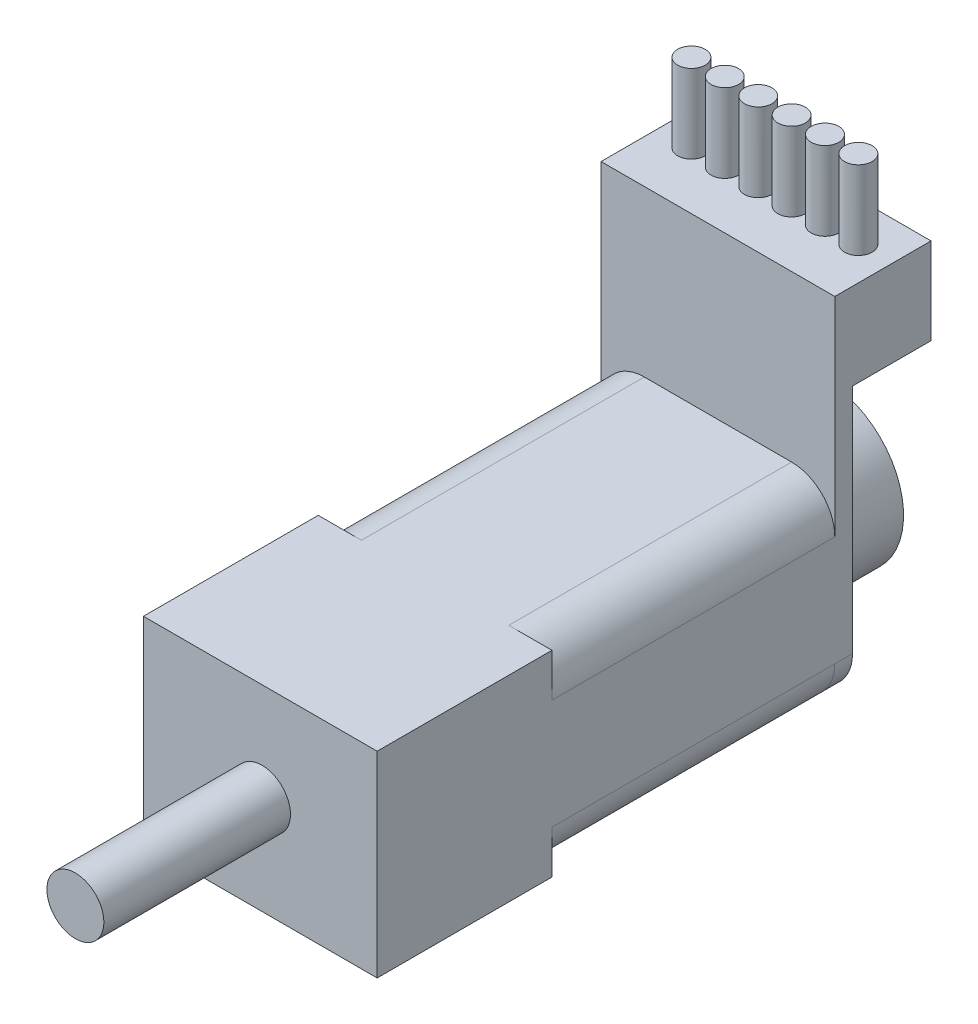
ISO-10303-21;
HEADER;
FILE_DESCRIPTION(('STEP AP214'),'2;1');
FILE_NAME('part.step','',(''),(''),'','','');
FILE_SCHEMA(('AUTOMOTIVE_DESIGN { 1 0 10303 214 1 1 1 1 }'));
ENDSEC;
DATA;
#1=APPLICATION_CONTEXT('core data for automotive mechanical design processes');
#2=APPLICATION_PROTOCOL_DEFINITION('international standard','automotive_design',2000,#1);
#3=PRODUCT_CONTEXT('',#1,'mechanical');
#4=PRODUCT('Part','Part','',(#3));
#5=PRODUCT_RELATED_PRODUCT_CATEGORY('part','',(#4));
#6=PRODUCT_DEFINITION_FORMATION('','',#4);
#7=PRODUCT_DEFINITION_CONTEXT('part definition',#1,'design');
#8=PRODUCT_DEFINITION('design','',#6,#7);
#9=PRODUCT_DEFINITION_SHAPE('','',#8);
#10=(LENGTH_UNIT() NAMED_UNIT(*) SI_UNIT(.MILLI.,.METRE.));
#11=(NAMED_UNIT(*) PLANE_ANGLE_UNIT() SI_UNIT($,.RADIAN.));
#12=(NAMED_UNIT(*) SI_UNIT($,.STERADIAN.) SOLID_ANGLE_UNIT());
#13=UNCERTAINTY_MEASURE_WITH_UNIT(LENGTH_MEASURE(1.E-05),#10,'distance_accuracy_value','');
#14=(GEOMETRIC_REPRESENTATION_CONTEXT(3) GLOBAL_UNCERTAINTY_ASSIGNED_CONTEXT((#13)) GLOBAL_UNIT_ASSIGNED_CONTEXT((#10,
#11,#12)) REPRESENTATION_CONTEXT('',''));
#15=CARTESIAN_POINT('',(0.,0.,0.));
#16=DIRECTION('',(0.,0.,1.));
#17=DIRECTION('',(1.,0.,0.));
#18=AXIS2_PLACEMENT_3D('',#15,#16,#17);
#19=CARTESIAN_POINT('',(0.,0.,-0.9));
#20=DIRECTION('',(0.,0.,-1.));
#21=DIRECTION('',(-1.,0.,0.));
#22=AXIS2_PLACEMENT_3D('',#19,#20,#21);
#23=PLANE('',#22);
#24=CARTESIAN_POINT('',(5.9,5.,-0.9));
#25=DIRECTION('',(0.,0.,-1.));
#26=DIRECTION('',(-1.,0.,0.));
#27=AXIS2_PLACEMENT_3D('',#24,#25,#26);
#28=CIRCLE('',#27,4.);
#29=CARTESIAN_POINT('',(1.9,5.,-0.9));
#30=VERTEX_POINT('',#29);
#31=EDGE_CURVE('E207',#30,#30,#28,.T.);
#32=ORIENTED_EDGE('',*,*,#31,.F.);
#33=EDGE_LOOP('',(#32));
#34=FACE_BOUND('',#33,.T.);
#35=DIRECTION('',(0.,1.,0.));
#36=VECTOR('',#35,1.);
#37=CARTESIAN_POINT('',(0.,0.,-0.9));
#38=LINE('',#37,#36);
#39=CARTESIAN_POINT('',(0.,2.2,-0.9));
#40=VERTEX_POINT('',#39);
#41=CARTESIAN_POINT('',(0.,14.,-0.9));
#42=VERTEX_POINT('',#41);
#43=EDGE_CURVE('E66',#40,#42,#38,.T.);
#44=ORIENTED_EDGE('',*,*,#43,.T.);
#45=DIRECTION('',(-1.,0.,0.));
#46=VECTOR('',#45,1.);
#47=CARTESIAN_POINT('',(11.9,14.,-0.9));
#48=LINE('',#47,#46);
#49=CARTESIAN_POINT('',(11.9,14.,-0.9));
#50=VERTEX_POINT('',#49);
#51=EDGE_CURVE('E61',#50,#42,#48,.T.);
#52=ORIENTED_EDGE('',*,*,#51,.F.);
#53=DIRECTION('',(0.,-1.,0.));
#54=VECTOR('',#53,1.);
#55=CARTESIAN_POINT('',(11.9,0.,-0.9));
#56=LINE('',#55,#54);
#57=CARTESIAN_POINT('',(11.9,2.2,-0.9));
#58=VERTEX_POINT('',#57);
#59=EDGE_CURVE('E195',#50,#58,#56,.T.);
#60=ORIENTED_EDGE('',*,*,#59,.T.);
#61=CARTESIAN_POINT('',(9.7,2.2,-0.9));
#62=DIRECTION('',(0.,0.,-1.));
#63=DIRECTION('',(-1.,0.,0.));
#64=AXIS2_PLACEMENT_3D('',#61,#62,#63);
#65=CIRCLE('',#64,2.2);
#66=CARTESIAN_POINT('',(9.7,0.,-0.9));
#67=VERTEX_POINT('',#66);
#68=EDGE_CURVE('E365',#58,#67,#65,.T.);
#69=ORIENTED_EDGE('',*,*,#68,.T.);
#70=DIRECTION('',(-1.,0.,0.));
#71=VECTOR('',#70,1.);
#72=CARTESIAN_POINT('',(11.9,0.,-0.9));
#73=LINE('',#72,#71);
#74=CARTESIAN_POINT('',(2.2,0.,-0.9));
#75=VERTEX_POINT('',#74);
#76=EDGE_CURVE('E213',#67,#75,#73,.T.);
#77=ORIENTED_EDGE('',*,*,#76,.T.);
#78=CARTESIAN_POINT('',(2.2,2.2,-0.9));
#79=DIRECTION('',(0.,0.,-1.));
#80=DIRECTION('',(-1.,0.,0.));
#81=AXIS2_PLACEMENT_3D('',#78,#79,#80);
#82=CIRCLE('',#81,2.2);
#83=EDGE_CURVE('E368',#75,#40,#82,.T.);
#84=ORIENTED_EDGE('',*,*,#83,.T.);
#85=EDGE_LOOP('',(#44,#52,#60,#69,#77,#84));
#86=FACE_BOUND('',#85,.T.);
#87=ADVANCED_FACE('F45',(#34,#86),#23,.T.);
#88=CARTESIAN_POINT('',(0.,0.,14.4));
#89=DIRECTION('',(1.,0.,0.));
#90=DIRECTION('',(0.,0.,-1.));
#91=AXIS2_PLACEMENT_3D('',#88,#89,#90);
#92=PLANE('',#91);
#93=ORIENTED_EDGE('',*,*,#43,.F.);
#94=DIRECTION('',(0.,0.,1.));
#95=VECTOR('',#94,1.);
#96=CARTESIAN_POINT('',(0.,2.2,14.4));
#97=LINE('',#96,#95);
#98=CARTESIAN_POINT('',(0.,2.2,0.));
#99=VERTEX_POINT('',#98);
#100=EDGE_CURVE('E246',#40,#99,#97,.T.);
#101=ORIENTED_EDGE('',*,*,#100,.T.);
#102=DIRECTION('',(0.,0.,-1.));
#103=VECTOR('',#102,1.);
#104=CARTESIAN_POINT('',(0.,2.2,14.4));
#105=LINE('',#104,#103);
#106=CARTESIAN_POINT('',(0.,2.2,14.4));
#107=VERTEX_POINT('',#106);
#108=EDGE_CURVE('E324',#99,#107,#105,.F.);
#109=ORIENTED_EDGE('',*,*,#108,.T.);
#110=DIRECTION('',(0.,-1.,0.));
#111=VECTOR('',#110,1.);
#112=CARTESIAN_POINT('',(0.,0.,14.4));
#113=LINE('',#112,#111);
#114=CARTESIAN_POINT('',(0.,0.,14.4));
#115=VERTEX_POINT('',#114);
#116=EDGE_CURVE('E241',#107,#115,#113,.T.);
#117=ORIENTED_EDGE('',*,*,#116,.T.);
#118=DIRECTION('',(0.,0.,-1.));
#119=VECTOR('',#118,1.);
#120=CARTESIAN_POINT('',(0.,0.,23.3));
#121=LINE('',#120,#119);
#122=CARTESIAN_POINT('',(0.,0.,23.3));
#123=VERTEX_POINT('',#122);
#124=EDGE_CURVE('E292',#123,#115,#121,.T.);
#125=ORIENTED_EDGE('',*,*,#124,.F.);
#126=DIRECTION('',(0.,-1.,0.));
#127=VECTOR('',#126,1.);
#128=CARTESIAN_POINT('',(0.,0.,23.3));
#129=LINE('',#128,#127);
#130=CARTESIAN_POINT('',(0.,10.,23.3));
#131=VERTEX_POINT('',#130);
#132=EDGE_CURVE('E248',#131,#123,#129,.T.);
#133=ORIENTED_EDGE('',*,*,#132,.F.);
#134=DIRECTION('',(0.,0.,-1.));
#135=VECTOR('',#134,1.);
#136=CARTESIAN_POINT('',(0.,10.,23.3));
#137=LINE('',#136,#135);
#138=CARTESIAN_POINT('',(0.,10.,14.4));
#139=VERTEX_POINT('',#138);
#140=EDGE_CURVE('E262',#131,#139,#137,.T.);
#141=ORIENTED_EDGE('',*,*,#140,.T.);
#142=CARTESIAN_POINT('',(0.,7.8,14.4));
#143=VERTEX_POINT('',#142);
#144=EDGE_CURVE('E263',#139,#143,#113,.T.);
#145=ORIENTED_EDGE('',*,*,#144,.T.);
#146=DIRECTION('',(0.,0.,-1.));
#147=VECTOR('',#146,1.);
#148=CARTESIAN_POINT('',(0.,7.8,14.4));
#149=LINE('',#148,#147);
#150=CARTESIAN_POINT('',(0.,7.8,0.));
#151=VERTEX_POINT('',#150);
#152=EDGE_CURVE('E320',#143,#151,#149,.T.);
#153=ORIENTED_EDGE('',*,*,#152,.T.);
#154=DIRECTION('',(0.,1.,0.));
#155=VECTOR('',#154,1.);
#156=CARTESIAN_POINT('',(0.,0.,0.));
#157=LINE('',#156,#155);
#158=CARTESIAN_POINT('',(0.,18.4,0.));
#159=VERTEX_POINT('',#158);
#160=EDGE_CURVE('E202',#151,#159,#157,.T.);
#161=ORIENTED_EDGE('',*,*,#160,.T.);
#162=DIRECTION('',(0.,0.,1.));
#163=VECTOR('',#162,1.);
#164=CARTESIAN_POINT('',(0.,18.4,-0.9));
#165=LINE('',#164,#163);
#166=CARTESIAN_POINT('',(0.,18.4,-4.9));
#167=VERTEX_POINT('',#166);
#168=EDGE_CURVE('E233',#167,#159,#165,.T.);
#169=ORIENTED_EDGE('',*,*,#168,.F.);
#170=DIRECTION('',(0.,1.,0.));
#171=VECTOR('',#170,1.);
#172=CARTESIAN_POINT('',(0.,18.4,-4.9));
#173=LINE('',#172,#171);
#174=CARTESIAN_POINT('',(0.,14.,-4.9));
#175=VERTEX_POINT('',#174);
#176=EDGE_CURVE('E180',#175,#167,#173,.T.);
#177=ORIENTED_EDGE('',*,*,#176,.F.);
#178=DIRECTION('',(0.,0.,1.));
#179=VECTOR('',#178,1.);
#180=CARTESIAN_POINT('',(0.,14.,-4.9));
#181=LINE('',#180,#179);
#182=EDGE_CURVE('E175',#175,#42,#181,.T.);
#183=ORIENTED_EDGE('',*,*,#182,.T.);
#184=EDGE_LOOP('',(#93,#101,#109,#117,#125,#133,#141,#145,#153,#161,#169,#177,#183));
#185=FACE_BOUND('',#184,.T.);
#186=ADVANCED_FACE('F433',(#185),#92,.F.);
#187=CARTESIAN_POINT('',(0.,0.,14.4));
#188=DIRECTION('',(0.,1.,0.));
#189=DIRECTION('',(0.,0.,1.));
#190=AXIS2_PLACEMENT_3D('',#187,#188,#189);
#191=PLANE('',#190);
#192=DIRECTION('',(0.,0.,-1.));
#193=VECTOR('',#192,1.);
#194=CARTESIAN_POINT('',(2.2,0.,14.4));
#195=LINE('',#194,#193);
#196=CARTESIAN_POINT('',(2.2,0.,14.4));
#197=VERTEX_POINT('',#196);
#198=CARTESIAN_POINT('',(2.2,0.,0.));
#199=VERTEX_POINT('',#198);
#200=EDGE_CURVE('E302',#197,#199,#195,.T.);
#201=ORIENTED_EDGE('',*,*,#200,.T.);
#202=DIRECTION('',(0.,0.,1.));
#203=VECTOR('',#202,1.);
#204=CARTESIAN_POINT('',(2.2,0.,14.4));
#205=LINE('',#204,#203);
#206=EDGE_CURVE('E362',#199,#75,#205,.F.);
#207=ORIENTED_EDGE('',*,*,#206,.T.);
#208=ORIENTED_EDGE('',*,*,#76,.F.);
#209=DIRECTION('',(0.,0.,1.));
#210=VECTOR('',#209,1.);
#211=CARTESIAN_POINT('',(9.7,0.,14.4));
#212=LINE('',#211,#210);
#213=CARTESIAN_POINT('',(9.7,0.,0.));
#214=VERTEX_POINT('',#213);
#215=EDGE_CURVE('E358',#67,#214,#212,.T.);
#216=ORIENTED_EDGE('',*,*,#215,.T.);
#217=DIRECTION('',(0.,0.,-1.));
#218=VECTOR('',#217,1.);
#219=CARTESIAN_POINT('',(9.7,0.,14.4));
#220=LINE('',#219,#218);
#221=CARTESIAN_POINT('',(9.7,0.,14.4));
#222=VERTEX_POINT('',#221);
#223=EDGE_CURVE('E299',#214,#222,#220,.F.);
#224=ORIENTED_EDGE('',*,*,#223,.T.);
#225=DIRECTION('',(1.,0.,0.));
#226=VECTOR('',#225,1.);
#227=CARTESIAN_POINT('',(0.,0.,14.4));
#228=LINE('',#227,#226);
#229=CARTESIAN_POINT('',(11.9,0.,14.4));
#230=VERTEX_POINT('',#229);
#231=EDGE_CURVE('E267',#222,#230,#228,.T.);
#232=ORIENTED_EDGE('',*,*,#231,.T.);
#233=DIRECTION('',(0.,0.,-1.));
#234=VECTOR('',#233,1.);
#235=CARTESIAN_POINT('',(11.9,0.,23.3));
#236=LINE('',#235,#234);
#237=CARTESIAN_POINT('',(11.9,0.,23.3));
#238=VERTEX_POINT('',#237);
#239=EDGE_CURVE('E288',#238,#230,#236,.T.);
#240=ORIENTED_EDGE('',*,*,#239,.F.);
#241=DIRECTION('',(1.,0.,0.));
#242=VECTOR('',#241,1.);
#243=CARTESIAN_POINT('',(0.,0.,23.3));
#244=LINE('',#243,#242);
#245=EDGE_CURVE('E252',#123,#238,#244,.T.);
#246=ORIENTED_EDGE('',*,*,#245,.F.);
#247=ORIENTED_EDGE('',*,*,#124,.T.);
#248=EDGE_CURVE('E268',#115,#197,#228,.T.);
#249=ORIENTED_EDGE('',*,*,#248,.T.);
#250=EDGE_LOOP('',(#201,#207,#208,#216,#224,#232,#240,#246,#247,#249));
#251=FACE_BOUND('',#250,.T.);
#252=ADVANCED_FACE('F440',(#251),#191,.F.);
#253=CARTESIAN_POINT('',(11.9,0.,14.4));
#254=DIRECTION('',(-1.,0.,0.));
#255=DIRECTION('',(0.,0.,1.));
#256=AXIS2_PLACEMENT_3D('',#253,#254,#255);
#257=PLANE('',#256);
#258=DIRECTION('',(0.,0.,-1.));
#259=VECTOR('',#258,1.);
#260=CARTESIAN_POINT('',(11.9,2.2,14.4));
#261=LINE('',#260,#259);
#262=CARTESIAN_POINT('',(11.9,2.2,14.4));
#263=VERTEX_POINT('',#262);
#264=CARTESIAN_POINT('',(11.9,2.2,0.));
#265=VERTEX_POINT('',#264);
#266=EDGE_CURVE('E247',#263,#265,#261,.T.);
#267=ORIENTED_EDGE('',*,*,#266,.T.);
#268=DIRECTION('',(0.,0.,1.));
#269=VECTOR('',#268,1.);
#270=CARTESIAN_POINT('',(11.9,2.2,14.4));
#271=LINE('',#270,#269);
#272=EDGE_CURVE('E212',#265,#58,#271,.F.);
#273=ORIENTED_EDGE('',*,*,#272,.T.);
#274=ORIENTED_EDGE('',*,*,#59,.F.);
#275=DIRECTION('',(0.,0.,1.));
#276=VECTOR('',#275,1.);
#277=CARTESIAN_POINT('',(11.9,14.,-4.9));
#278=LINE('',#277,#276);
#279=CARTESIAN_POINT('',(11.9,14.,-4.9));
#280=VERTEX_POINT('',#279);
#281=EDGE_CURVE('E173',#280,#50,#278,.T.);
#282=ORIENTED_EDGE('',*,*,#281,.F.);
#283=DIRECTION('',(0.,-1.,0.));
#284=VECTOR('',#283,1.);
#285=CARTESIAN_POINT('',(11.9,18.4,-4.9));
#286=LINE('',#285,#284);
#287=CARTESIAN_POINT('',(11.9,18.4,-4.9));
#288=VERTEX_POINT('',#287);
#289=EDGE_CURVE('E181',#288,#280,#286,.T.);
#290=ORIENTED_EDGE('',*,*,#289,.F.);
#291=DIRECTION('',(0.,0.,1.));
#292=VECTOR('',#291,1.);
#293=CARTESIAN_POINT('',(11.9,18.4,-0.9));
#294=LINE('',#293,#292);
#295=CARTESIAN_POINT('',(11.9,18.4,0.));
#296=VERTEX_POINT('',#295);
#297=EDGE_CURVE('E222',#288,#296,#294,.T.);
#298=ORIENTED_EDGE('',*,*,#297,.T.);
#299=DIRECTION('',(0.,-1.,0.));
#300=VECTOR('',#299,1.);
#301=CARTESIAN_POINT('',(11.9,0.,0.));
#302=LINE('',#301,#300);
#303=CARTESIAN_POINT('',(11.9,7.8,0.));
#304=VERTEX_POINT('',#303);
#305=EDGE_CURVE('E217',#296,#304,#302,.T.);
#306=ORIENTED_EDGE('',*,*,#305,.T.);
#307=DIRECTION('',(0.,0.,-1.));
#308=VECTOR('',#307,1.);
#309=CARTESIAN_POINT('',(11.9,7.8,14.4));
#310=LINE('',#309,#308);
#311=CARTESIAN_POINT('',(11.9,7.8,14.4));
#312=VERTEX_POINT('',#311);
#313=EDGE_CURVE('E350',#304,#312,#310,.F.);
#314=ORIENTED_EDGE('',*,*,#313,.T.);
#315=DIRECTION('',(0.,1.,0.));
#316=VECTOR('',#315,1.);
#317=CARTESIAN_POINT('',(11.9,0.,14.4));
#318=LINE('',#317,#316);
#319=CARTESIAN_POINT('',(11.9,10.,14.4));
#320=VERTEX_POINT('',#319);
#321=EDGE_CURVE('E272',#312,#320,#318,.T.);
#322=ORIENTED_EDGE('',*,*,#321,.T.);
#323=DIRECTION('',(0.,0.,-1.));
#324=VECTOR('',#323,1.);
#325=CARTESIAN_POINT('',(11.9,10.,23.3));
#326=LINE('',#325,#324);
#327=CARTESIAN_POINT('',(11.9,10.,23.3));
#328=VERTEX_POINT('',#327);
#329=EDGE_CURVE('E284',#328,#320,#326,.T.);
#330=ORIENTED_EDGE('',*,*,#329,.F.);
#331=DIRECTION('',(0.,1.,0.));
#332=VECTOR('',#331,1.);
#333=CARTESIAN_POINT('',(11.9,0.,23.3));
#334=LINE('',#333,#332);
#335=EDGE_CURVE('E256',#238,#328,#334,.T.);
#336=ORIENTED_EDGE('',*,*,#335,.F.);
#337=ORIENTED_EDGE('',*,*,#239,.T.);
#338=EDGE_CURVE('E273',#230,#263,#318,.T.);
#339=ORIENTED_EDGE('',*,*,#338,.T.);
#340=EDGE_LOOP('',(#267,#273,#274,#282,#290,#298,#306,#314,#322,#330,#336,#337,#339));
#341=FACE_BOUND('',#340,.T.);
#342=ADVANCED_FACE('F193',(#341),#257,.F.);
#343=CARTESIAN_POINT('',(0.,10.,14.4));
#344=DIRECTION('',(0.,-1.,0.));
#345=DIRECTION('',(0.,0.,-1.));
#346=AXIS2_PLACEMENT_3D('',#343,#344,#345);
#347=PLANE('',#346);
#348=DIRECTION('',(-1.,0.,0.));
#349=VECTOR('',#348,1.);
#350=CARTESIAN_POINT('',(0.,10.,0.));
#351=LINE('',#350,#349);
#352=CARTESIAN_POINT('',(9.7,10.,0.));
#353=VERTEX_POINT('',#352);
#354=CARTESIAN_POINT('',(2.2,10.,0.));
#355=VERTEX_POINT('',#354);
#356=EDGE_CURVE('E296',#353,#355,#351,.T.);
#357=ORIENTED_EDGE('',*,*,#356,.T.);
#358=DIRECTION('',(0.,0.,-1.));
#359=VECTOR('',#358,1.);
#360=CARTESIAN_POINT('',(2.2,10.,14.4));
#361=LINE('',#360,#359);
#362=CARTESIAN_POINT('',(2.2,10.,14.4));
#363=VERTEX_POINT('',#362);
#364=EDGE_CURVE('E347',#355,#363,#361,.F.);
#365=ORIENTED_EDGE('',*,*,#364,.T.);
#366=DIRECTION('',(-1.,0.,0.));
#367=VECTOR('',#366,1.);
#368=CARTESIAN_POINT('',(0.,10.,14.4));
#369=LINE('',#368,#367);
#370=EDGE_CURVE('E277',#363,#139,#369,.T.);
#371=ORIENTED_EDGE('',*,*,#370,.T.);
#372=ORIENTED_EDGE('',*,*,#140,.F.);
#373=DIRECTION('',(-1.,0.,0.));
#374=VECTOR('',#373,1.);
#375=CARTESIAN_POINT('',(0.,10.,23.3));
#376=LINE('',#375,#374);
#377=EDGE_CURVE('E259',#328,#131,#376,.T.);
#378=ORIENTED_EDGE('',*,*,#377,.F.);
#379=ORIENTED_EDGE('',*,*,#329,.T.);
#380=CARTESIAN_POINT('',(9.7,10.,14.4));
#381=VERTEX_POINT('',#380);
#382=EDGE_CURVE('E253',#320,#381,#369,.T.);
#383=ORIENTED_EDGE('',*,*,#382,.T.);
#384=DIRECTION('',(0.,0.,-1.));
#385=VECTOR('',#384,1.);
#386=CARTESIAN_POINT('',(9.7,10.,14.4));
#387=LINE('',#386,#385);
#388=EDGE_CURVE('E343',#381,#353,#387,.T.);
#389=ORIENTED_EDGE('',*,*,#388,.T.);
#390=EDGE_LOOP('',(#357,#365,#371,#372,#378,#379,#383,#389));
#391=FACE_BOUND('',#390,.T.);
#392=ADVANCED_FACE('F417',(#391),#347,.F.);
#393=CARTESIAN_POINT('',(2.2,2.2,14.4));
#394=DIRECTION('',(0.,0.,-1.));
#395=DIRECTION('',(-1.,0.,0.));
#396=AXIS2_PLACEMENT_3D('',#393,#394,#395);
#397=CYLINDRICAL_SURFACE('',#396,2.2);
#398=CARTESIAN_POINT('',(2.2,2.2,14.4));
#399=DIRECTION('',(0.,0.,-1.));
#400=DIRECTION('',(-1.,0.,0.));
#401=AXIS2_PLACEMENT_3D('',#398,#399,#400);
#402=CIRCLE('',#401,2.2);
#403=EDGE_CURVE('E339',#107,#197,#402,.F.);
#404=ORIENTED_EDGE('',*,*,#403,.F.);
#405=ORIENTED_EDGE('',*,*,#108,.F.);
#406=CARTESIAN_POINT('',(2.2,2.2,0.));
#407=DIRECTION('',(0.,0.,-1.));
#408=DIRECTION('',(-1.,0.,0.));
#409=AXIS2_PLACEMENT_3D('',#406,#407,#408);
#410=CIRCLE('',#409,2.2);
#411=EDGE_CURVE('E317',#199,#99,#410,.T.);
#412=ORIENTED_EDGE('',*,*,#411,.F.);
#413=ORIENTED_EDGE('',*,*,#200,.F.);
#414=EDGE_LOOP('',(#404,#405,#412,#413));
#415=FACE_BOUND('',#414,.T.);
#416=ADVANCED_FACE('F531',(#415),#397,.T.);
#417=CARTESIAN_POINT('',(2.2,7.8,14.4));
#418=DIRECTION('',(0.,0.,-1.));
#419=DIRECTION('',(-1.,0.,0.));
#420=AXIS2_PLACEMENT_3D('',#417,#418,#419);
#421=CYLINDRICAL_SURFACE('',#420,2.2);
#422=CARTESIAN_POINT('',(2.2,7.8,14.4));
#423=DIRECTION('',(0.,0.,-1.));
#424=DIRECTION('',(-1.,0.,0.));
#425=AXIS2_PLACEMENT_3D('',#422,#423,#424);
#426=CIRCLE('',#425,2.2);
#427=EDGE_CURVE('E335',#363,#143,#426,.F.);
#428=ORIENTED_EDGE('',*,*,#427,.F.);
#429=ORIENTED_EDGE('',*,*,#364,.F.);
#430=CARTESIAN_POINT('',(2.2,7.8,0.));
#431=DIRECTION('',(0.,0.,-1.));
#432=DIRECTION('',(-1.,0.,0.));
#433=AXIS2_PLACEMENT_3D('',#430,#431,#432);
#434=CIRCLE('',#433,2.2);
#435=EDGE_CURVE('E313',#151,#355,#434,.T.);
#436=ORIENTED_EDGE('',*,*,#435,.F.);
#437=ORIENTED_EDGE('',*,*,#152,.F.);
#438=EDGE_LOOP('',(#428,#429,#436,#437));
#439=FACE_BOUND('',#438,.T.);
#440=ADVANCED_FACE('F452',(#439),#421,.T.);
#441=CARTESIAN_POINT('',(9.7,2.2,14.4));
#442=DIRECTION('',(0.,0.,-1.));
#443=DIRECTION('',(-1.,0.,0.));
#444=AXIS2_PLACEMENT_3D('',#441,#442,#443);
#445=CYLINDRICAL_SURFACE('',#444,2.2);
#446=CARTESIAN_POINT('',(9.7,2.2,14.4));
#447=DIRECTION('',(0.,0.,-1.));
#448=DIRECTION('',(-1.,0.,0.));
#449=AXIS2_PLACEMENT_3D('',#446,#447,#448);
#450=CIRCLE('',#449,2.2);
#451=EDGE_CURVE('E331',#222,#263,#450,.F.);
#452=ORIENTED_EDGE('',*,*,#451,.F.);
#453=ORIENTED_EDGE('',*,*,#223,.F.);
#454=CARTESIAN_POINT('',(9.7,2.2,0.));
#455=DIRECTION('',(0.,0.,-1.));
#456=DIRECTION('',(-1.,0.,0.));
#457=AXIS2_PLACEMENT_3D('',#454,#455,#456);
#458=CIRCLE('',#457,2.2);
#459=EDGE_CURVE('E310',#265,#214,#458,.T.);
#460=ORIENTED_EDGE('',*,*,#459,.F.);
#461=ORIENTED_EDGE('',*,*,#266,.F.);
#462=EDGE_LOOP('',(#452,#453,#460,#461));
#463=FACE_BOUND('',#462,.T.);
#464=ADVANCED_FACE('F541',(#463),#445,.T.);
#465=CARTESIAN_POINT('',(9.7,7.8,14.4));
#466=DIRECTION('',(0.,0.,-1.));
#467=DIRECTION('',(-1.,0.,0.));
#468=AXIS2_PLACEMENT_3D('',#465,#466,#467);
#469=CYLINDRICAL_SURFACE('',#468,2.2);
#470=CARTESIAN_POINT('',(9.7,7.8,14.4));
#471=DIRECTION('',(0.,0.,-1.));
#472=DIRECTION('',(-1.,0.,0.));
#473=AXIS2_PLACEMENT_3D('',#470,#471,#472);
#474=CIRCLE('',#473,2.2);
#475=EDGE_CURVE('E327',#312,#381,#474,.F.);
#476=ORIENTED_EDGE('',*,*,#475,.F.);
#477=ORIENTED_EDGE('',*,*,#313,.F.);
#478=CARTESIAN_POINT('',(9.7,7.8,0.));
#479=DIRECTION('',(0.,0.,-1.));
#480=DIRECTION('',(-1.,0.,0.));
#481=AXIS2_PLACEMENT_3D('',#478,#479,#480);
#482=CIRCLE('',#481,2.2);
#483=EDGE_CURVE('E306',#353,#304,#482,.T.);
#484=ORIENTED_EDGE('',*,*,#483,.F.);
#485=ORIENTED_EDGE('',*,*,#388,.F.);
#486=EDGE_LOOP('',(#476,#477,#484,#485));
#487=FACE_BOUND('',#486,.T.);
#488=ADVANCED_FACE('F415',(#487),#469,.T.);
#489=CARTESIAN_POINT('',(0.,0.,14.4));
#490=DIRECTION('',(0.,0.,-1.));
#491=DIRECTION('',(-1.,0.,0.));
#492=AXIS2_PLACEMENT_3D('',#489,#490,#491);
#493=PLANE('',#492);
#494=ORIENTED_EDGE('',*,*,#116,.F.);
#495=ORIENTED_EDGE('',*,*,#403,.T.);
#496=ORIENTED_EDGE('',*,*,#248,.F.);
#497=EDGE_LOOP('',(#494,#495,#496));
#498=FACE_BOUND('',#497,.T.);
#499=ADVANCED_FACE('F438',(#498),#493,.T.);
#500=ORIENTED_EDGE('',*,*,#231,.F.);
#501=ORIENTED_EDGE('',*,*,#451,.T.);
#502=ORIENTED_EDGE('',*,*,#338,.F.);
#503=EDGE_LOOP('',(#500,#501,#502));
#504=FACE_BOUND('',#503,.T.);
#505=ADVANCED_FACE('F564',(#504),#493,.T.);
#506=ORIENTED_EDGE('',*,*,#321,.F.);
#507=ORIENTED_EDGE('',*,*,#475,.T.);
#508=ORIENTED_EDGE('',*,*,#382,.F.);
#509=EDGE_LOOP('',(#506,#507,#508));
#510=FACE_BOUND('',#509,.T.);
#511=ADVANCED_FACE('F424',(#510),#493,.T.);
#512=CARTESIAN_POINT('',(0.,0.,23.3));
#513=DIRECTION('',(0.,0.,-1.));
#514=DIRECTION('',(-1.,0.,0.));
#515=AXIS2_PLACEMENT_3D('',#512,#513,#514);
#516=PLANE('',#515);
#517=CARTESIAN_POINT('',(6.03515289095129,5.,23.3));
#518=DIRECTION('',(0.,0.,1.));
#519=DIRECTION('',(1.,0.,0.));
#520=AXIS2_PLACEMENT_3D('',#517,#518,#519);
#521=CIRCLE('',#520,1.45);
#522=CARTESIAN_POINT('',(7.48515289095129,5.,23.3));
#523=VERTEX_POINT('',#522);
#524=EDGE_CURVE('E242',#523,#523,#521,.T.);
#525=ORIENTED_EDGE('',*,*,#524,.F.);
#526=EDGE_LOOP('',(#525));
#527=FACE_BOUND('',#526,.T.);
#528=ORIENTED_EDGE('',*,*,#132,.T.);
#529=ORIENTED_EDGE('',*,*,#245,.T.);
#530=ORIENTED_EDGE('',*,*,#335,.T.);
#531=ORIENTED_EDGE('',*,*,#377,.T.);
#532=EDGE_LOOP('',(#528,#529,#530,#531));
#533=FACE_BOUND('',#532,.T.);
#534=ADVANCED_FACE('F444',(#527,#533),#516,.F.);
#535=ORIENTED_EDGE('',*,*,#370,.F.);
#536=ORIENTED_EDGE('',*,*,#427,.T.);
#537=ORIENTED_EDGE('',*,*,#144,.F.);
#538=EDGE_LOOP('',(#535,#536,#537));
#539=FACE_BOUND('',#538,.T.);
#540=ADVANCED_FACE('F449',(#539),#493,.T.);
#541=CARTESIAN_POINT('',(6.03515289095129,5.,32.8));
#542=DIRECTION('',(0.,0.,-1.));
#543=DIRECTION('',(-1.,0.,0.));
#544=AXIS2_PLACEMENT_3D('',#541,#542,#543);
#545=CYLINDRICAL_SURFACE('',#544,1.45);
#546=CARTESIAN_POINT('',(6.03515289095129,5.,32.8));
#547=DIRECTION('',(0.,0.,1.));
#548=DIRECTION('',(1.,0.,0.));
#549=AXIS2_PLACEMENT_3D('',#546,#547,#548);
#550=CIRCLE('',#549,1.45);
#551=CARTESIAN_POINT('',(7.48515289095129,5.,32.8));
#552=VERTEX_POINT('',#551);
#553=EDGE_CURVE('E237',#552,#552,#550,.T.);
#554=ORIENTED_EDGE('',*,*,#553,.F.);
#555=EDGE_LOOP('',(#554));
#556=FACE_BOUND('',#555,.T.);
#557=ORIENTED_EDGE('',*,*,#524,.T.);
#558=EDGE_LOOP('',(#557));
#559=FACE_BOUND('',#558,.T.);
#560=ADVANCED_FACE('F519',(#556,#559),#545,.T.);
#561=CARTESIAN_POINT('',(6.03515289095129,5.,32.8));
#562=DIRECTION('',(0.,0.,1.));
#563=DIRECTION('',(1.,0.,0.));
#564=AXIS2_PLACEMENT_3D('',#561,#562,#563);
#565=PLANE('',#564);
#566=ORIENTED_EDGE('',*,*,#553,.T.);
#567=EDGE_LOOP('',(#566));
#568=FACE_BOUND('',#567,.T.);
#569=ADVANCED_FACE('F515',(#568),#565,.T.);
#570=CARTESIAN_POINT('',(0.,0.,0.));
#571=DIRECTION('',(0.,0.,-1.));
#572=DIRECTION('',(-1.,0.,0.));
#573=AXIS2_PLACEMENT_3D('',#570,#571,#572);
#574=PLANE('',#573);
#575=ORIENTED_EDGE('',*,*,#160,.F.);
#576=ORIENTED_EDGE('',*,*,#435,.T.);
#577=ORIENTED_EDGE('',*,*,#356,.F.);
#578=ORIENTED_EDGE('',*,*,#483,.T.);
#579=ORIENTED_EDGE('',*,*,#305,.F.);
#580=DIRECTION('',(1.,0.,0.));
#581=VECTOR('',#580,1.);
#582=CARTESIAN_POINT('',(0.,18.4,0.));
#583=LINE('',#582,#581);
#584=EDGE_CURVE('E225',#159,#296,#583,.T.);
#585=ORIENTED_EDGE('',*,*,#584,.F.);
#586=EDGE_LOOP('',(#575,#576,#577,#578,#579,#585));
#587=FACE_BOUND('',#586,.T.);
#588=ADVANCED_FACE('F397',(#587),#574,.F.);
#589=CARTESIAN_POINT('',(0.,18.4,-0.9));
#590=DIRECTION('',(0.,-1.,0.));
#591=DIRECTION('',(0.,0.,-1.));
#592=AXIS2_PLACEMENT_3D('',#589,#590,#591);
#593=PLANE('',#592);
#594=CARTESIAN_POINT('',(1.7,18.4,-2.9));
#595=DIRECTION('',(0.,-1.,0.));
#596=DIRECTION('',(0.,0.,-1.));
#597=AXIS2_PLACEMENT_3D('',#594,#595,#596);
#598=CIRCLE('',#597,0.7);
#599=CARTESIAN_POINT('',(1.7,18.4,-3.6));
#600=VERTEX_POINT('',#599);
#601=EDGE_CURVE('E11',#600,#600,#598,.F.);
#602=ORIENTED_EDGE('',*,*,#601,.F.);
#603=EDGE_LOOP('',(#602));
#604=FACE_BOUND('',#603,.T.);
#605=CARTESIAN_POINT('',(10.2,18.4,-2.9));
#606=DIRECTION('',(0.,-1.,0.));
#607=DIRECTION('',(0.,0.,-1.));
#608=AXIS2_PLACEMENT_3D('',#605,#606,#607);
#609=CIRCLE('',#608,0.70096330864821);
#610=CARTESIAN_POINT('',(10.2,18.4,-3.60096330864821));
#611=VERTEX_POINT('',#610);
#612=EDGE_CURVE('E54',#611,#611,#609,.F.);
#613=ORIENTED_EDGE('',*,*,#612,.F.);
#614=EDGE_LOOP('',(#613));
#615=FACE_BOUND('',#614,.T.);
#616=CARTESIAN_POINT('',(8.5,18.4,-2.9));
#617=DIRECTION('',(0.,-1.,0.));
#618=DIRECTION('',(0.,0.,-1.));
#619=AXIS2_PLACEMENT_3D('',#616,#617,#618);
#620=CIRCLE('',#619,0.702469815686531);
#621=CARTESIAN_POINT('',(8.5,18.4,-3.60246981568653));
#622=VERTEX_POINT('',#621);
#623=EDGE_CURVE('E384',#622,#622,#620,.F.);
#624=ORIENTED_EDGE('',*,*,#623,.F.);
#625=EDGE_LOOP('',(#624));
#626=FACE_BOUND('',#625,.T.);
#627=CARTESIAN_POINT('',(6.8,18.4,-2.9));
#628=DIRECTION('',(0.,-1.,0.));
#629=DIRECTION('',(0.,0.,-1.));
#630=AXIS2_PLACEMENT_3D('',#627,#628,#629);
#631=CIRCLE('',#630,0.7);
#632=CARTESIAN_POINT('',(6.8,18.4,-3.6));
#633=VERTEX_POINT('',#632);
#634=EDGE_CURVE('E380',#633,#633,#631,.F.);
#635=ORIENTED_EDGE('',*,*,#634,.F.);
#636=EDGE_LOOP('',(#635));
#637=FACE_BOUND('',#636,.T.);
#638=CARTESIAN_POINT('',(5.1,18.4,-2.9));
#639=DIRECTION('',(0.,-1.,0.));
#640=DIRECTION('',(0.,0.,-1.));
#641=AXIS2_PLACEMENT_3D('',#638,#639,#640);
#642=CIRCLE('',#641,0.700000000000001);
#643=CARTESIAN_POINT('',(5.1,18.4,-3.6));
#644=VERTEX_POINT('',#643);
#645=EDGE_CURVE('E376',#644,#644,#642,.F.);
#646=ORIENTED_EDGE('',*,*,#645,.F.);
#647=EDGE_LOOP('',(#646));
#648=FACE_BOUND('',#647,.T.);
#649=CARTESIAN_POINT('',(3.4,18.4,-2.9));
#650=DIRECTION('',(0.,-1.,0.));
#651=DIRECTION('',(0.,0.,-1.));
#652=AXIS2_PLACEMENT_3D('',#649,#650,#651);
#653=CIRCLE('',#652,0.7);
#654=CARTESIAN_POINT('',(3.4,18.4,-3.6));
#655=VERTEX_POINT('',#654);
#656=EDGE_CURVE('E211',#655,#655,#653,.F.);
#657=ORIENTED_EDGE('',*,*,#656,.F.);
#658=EDGE_LOOP('',(#657));
#659=FACE_BOUND('',#658,.T.);
#660=ORIENTED_EDGE('',*,*,#584,.T.);
#661=ORIENTED_EDGE('',*,*,#297,.F.);
#662=DIRECTION('',(1.,0.,0.));
#663=VECTOR('',#662,1.);
#664=CARTESIAN_POINT('',(11.9,18.4,-4.9));
#665=LINE('',#664,#663);
#666=EDGE_CURVE('E187',#167,#288,#665,.T.);
#667=ORIENTED_EDGE('',*,*,#666,.F.);
#668=ORIENTED_EDGE('',*,*,#168,.T.);
#669=EDGE_LOOP('',(#660,#661,#667,#668));
#670=FACE_BOUND('',#669,.T.);
#671=ADVANCED_FACE('F393',(#604,#615,#626,#637,#648,#659,#670),#593,.F.);
#672=CARTESIAN_POINT('',(2.2,2.2,14.4));
#673=DIRECTION('',(0.,0.,1.));
#674=DIRECTION('',(1.,0.,0.));
#675=AXIS2_PLACEMENT_3D('',#672,#673,#674);
#676=CYLINDRICAL_SURFACE('',#675,2.2);
#677=ORIENTED_EDGE('',*,*,#83,.F.);
#678=ORIENTED_EDGE('',*,*,#206,.F.);
#679=ORIENTED_EDGE('',*,*,#411,.T.);
#680=ORIENTED_EDGE('',*,*,#100,.F.);
#681=EDGE_LOOP('',(#677,#678,#679,#680));
#682=FACE_BOUND('',#681,.T.);
#683=ADVANCED_FACE('F396',(#682),#676,.T.);
#684=CARTESIAN_POINT('',(9.7,2.2,14.4));
#685=DIRECTION('',(0.,0.,1.));
#686=DIRECTION('',(1.,0.,0.));
#687=AXIS2_PLACEMENT_3D('',#684,#685,#686);
#688=CYLINDRICAL_SURFACE('',#687,2.2);
#689=ORIENTED_EDGE('',*,*,#68,.F.);
#690=ORIENTED_EDGE('',*,*,#272,.F.);
#691=ORIENTED_EDGE('',*,*,#459,.T.);
#692=ORIENTED_EDGE('',*,*,#215,.F.);
#693=EDGE_LOOP('',(#689,#690,#691,#692));
#694=FACE_BOUND('',#693,.T.);
#695=ADVANCED_FACE('F47',(#694),#688,.T.);
#696=CARTESIAN_POINT('',(5.9,5.,-5.5));
#697=DIRECTION('',(0.,0.,1.));
#698=DIRECTION('',(1.,0.,0.));
#699=AXIS2_PLACEMENT_3D('',#696,#697,#698);
#700=CYLINDRICAL_SURFACE('',#699,4.);
#701=CARTESIAN_POINT('',(5.9,5.,-5.5));
#702=DIRECTION('',(0.,0.,-1.));
#703=DIRECTION('',(-1.,0.,0.));
#704=AXIS2_PLACEMENT_3D('',#701,#702,#703);
#705=CIRCLE('',#704,4.);
#706=CARTESIAN_POINT('',(1.9,5.,-5.5));
#707=VERTEX_POINT('',#706);
#708=EDGE_CURVE('E197',#707,#707,#705,.T.);
#709=ORIENTED_EDGE('',*,*,#708,.F.);
#710=EDGE_LOOP('',(#709));
#711=FACE_BOUND('',#710,.T.);
#712=ORIENTED_EDGE('',*,*,#31,.T.);
#713=EDGE_LOOP('',(#712));
#714=FACE_BOUND('',#713,.T.);
#715=ADVANCED_FACE('F512',(#711,#714),#700,.T.);
#716=CARTESIAN_POINT('',(5.9,5.,-5.5));
#717=DIRECTION('',(0.,0.,-1.));
#718=DIRECTION('',(-1.,0.,0.));
#719=AXIS2_PLACEMENT_3D('',#716,#717,#718);
#720=PLANE('',#719);
#721=ORIENTED_EDGE('',*,*,#708,.T.);
#722=EDGE_LOOP('',(#721));
#723=FACE_BOUND('',#722,.T.);
#724=ADVANCED_FACE('F676',(#723),#720,.T.);
#725=CARTESIAN_POINT('',(11.9,14.,-4.9));
#726=DIRECTION('',(0.,1.,0.));
#727=DIRECTION('',(0.,0.,1.));
#728=AXIS2_PLACEMENT_3D('',#725,#726,#727);
#729=PLANE('',#728);
#730=ORIENTED_EDGE('',*,*,#51,.T.);
#731=ORIENTED_EDGE('',*,*,#182,.F.);
#732=DIRECTION('',(-1.,0.,0.));
#733=VECTOR('',#732,1.);
#734=CARTESIAN_POINT('',(11.9,14.,-4.9));
#735=LINE('',#734,#733);
#736=EDGE_CURVE('E169',#280,#175,#735,.T.);
#737=ORIENTED_EDGE('',*,*,#736,.F.);
#738=ORIENTED_EDGE('',*,*,#281,.T.);
#739=EDGE_LOOP('',(#730,#731,#737,#738));
#740=FACE_BOUND('',#739,.T.);
#741=ADVANCED_FACE('F171',(#740),#729,.F.);
#742=CARTESIAN_POINT('',(0.,0.,-4.9));
#743=DIRECTION('',(0.,0.,-1.));
#744=DIRECTION('',(-1.,0.,0.));
#745=AXIS2_PLACEMENT_3D('',#742,#743,#744);
#746=PLANE('',#745);
#747=ORIENTED_EDGE('',*,*,#289,.T.);
#748=ORIENTED_EDGE('',*,*,#736,.T.);
#749=ORIENTED_EDGE('',*,*,#176,.T.);
#750=ORIENTED_EDGE('',*,*,#666,.T.);
#751=EDGE_LOOP('',(#747,#748,#749,#750));
#752=FACE_BOUND('',#751,.T.);
#753=ADVANCED_FACE('F185',(#752),#746,.T.);
#754=CARTESIAN_POINT('',(3.4,22.4,-2.9));
#755=DIRECTION('',(0.,-1.,0.));
#756=DIRECTION('',(0.,0.,-1.));
#757=AXIS2_PLACEMENT_3D('',#754,#755,#756);
#758=CYLINDRICAL_SURFACE('',#757,0.7);
#759=CARTESIAN_POINT('',(3.4,22.4,-2.9));
#760=DIRECTION('',(0.,1.,0.));
#761=DIRECTION('',(0.,0.,1.));
#762=AXIS2_PLACEMENT_3D('',#759,#760,#761);
#763=CIRCLE('',#762,0.7);
#764=CARTESIAN_POINT('',(3.4,22.4,-2.2));
#765=VERTEX_POINT('',#764);
#766=EDGE_CURVE('E458',#765,#765,#763,.T.);
#767=ORIENTED_EDGE('',*,*,#766,.F.);
#768=EDGE_LOOP('',(#767));
#769=FACE_BOUND('',#768,.T.);
#770=ORIENTED_EDGE('',*,*,#656,.T.);
#771=EDGE_LOOP('',(#770));
#772=FACE_BOUND('',#771,.T.);
#773=ADVANCED_FACE('F700',(#769,#772),#758,.T.);
#774=CARTESIAN_POINT('',(0.,22.4,0.));
#775=DIRECTION('',(0.,1.,0.));
#776=DIRECTION('',(0.,0.,1.));
#777=AXIS2_PLACEMENT_3D('',#774,#775,#776);
#778=PLANE('',#777);
#779=ORIENTED_EDGE('',*,*,#766,.T.);
#780=EDGE_LOOP('',(#779));
#781=FACE_BOUND('',#780,.T.);
#782=ADVANCED_FACE('F708',(#781),#778,.T.);
#783=CARTESIAN_POINT('',(5.1,22.4,-2.9));
#784=DIRECTION('',(0.,-1.,0.));
#785=DIRECTION('',(0.,0.,-1.));
#786=AXIS2_PLACEMENT_3D('',#783,#784,#785);
#787=CYLINDRICAL_SURFACE('',#786,0.700000000000001);
#788=CARTESIAN_POINT('',(5.1,22.4,-2.9));
#789=DIRECTION('',(0.,1.,0.));
#790=DIRECTION('',(0.,0.,1.));
#791=AXIS2_PLACEMENT_3D('',#788,#789,#790);
#792=CIRCLE('',#791,0.700000000000001);
#793=CARTESIAN_POINT('',(5.1,22.4,-2.2));
#794=VERTEX_POINT('',#793);
#795=EDGE_CURVE('E461',#794,#794,#792,.T.);
#796=ORIENTED_EDGE('',*,*,#795,.F.);
#797=EDGE_LOOP('',(#796));
#798=FACE_BOUND('',#797,.T.);
#799=ORIENTED_EDGE('',*,*,#645,.T.);
#800=EDGE_LOOP('',(#799));
#801=FACE_BOUND('',#800,.T.);
#802=ADVANCED_FACE('F717',(#798,#801),#787,.T.);
#803=CARTESIAN_POINT('',(0.,22.4,0.));
#804=DIRECTION('',(0.,1.,0.));
#805=DIRECTION('',(0.,0.,1.));
#806=AXIS2_PLACEMENT_3D('',#803,#804,#805);
#807=PLANE('',#806);
#808=ORIENTED_EDGE('',*,*,#795,.T.);
#809=EDGE_LOOP('',(#808));
#810=FACE_BOUND('',#809,.T.);
#811=ADVANCED_FACE('F725',(#810),#807,.T.);
#812=CARTESIAN_POINT('',(6.8,22.4,-2.9));
#813=DIRECTION('',(0.,-1.,0.));
#814=DIRECTION('',(0.,0.,-1.));
#815=AXIS2_PLACEMENT_3D('',#812,#813,#814);
#816=CYLINDRICAL_SURFACE('',#815,0.7);
#817=CARTESIAN_POINT('',(6.8,22.4,-2.9));
#818=DIRECTION('',(0.,1.,0.));
#819=DIRECTION('',(0.,0.,1.));
#820=AXIS2_PLACEMENT_3D('',#817,#818,#819);
#821=CIRCLE('',#820,0.7);
#822=CARTESIAN_POINT('',(6.8,22.4,-2.2));
#823=VERTEX_POINT('',#822);
#824=EDGE_CURVE('E467',#823,#823,#821,.T.);
#825=ORIENTED_EDGE('',*,*,#824,.F.);
#826=EDGE_LOOP('',(#825));
#827=FACE_BOUND('',#826,.T.);
#828=ORIENTED_EDGE('',*,*,#634,.T.);
#829=EDGE_LOOP('',(#828));
#830=FACE_BOUND('',#829,.T.);
#831=ADVANCED_FACE('F734',(#827,#830),#816,.T.);
#832=CARTESIAN_POINT('',(0.,22.4,0.));
#833=DIRECTION('',(0.,1.,0.));
#834=DIRECTION('',(0.,0.,1.));
#835=AXIS2_PLACEMENT_3D('',#832,#833,#834);
#836=PLANE('',#835);
#837=ORIENTED_EDGE('',*,*,#824,.T.);
#838=EDGE_LOOP('',(#837));
#839=FACE_BOUND('',#838,.T.);
#840=ADVANCED_FACE('F743',(#839),#836,.T.);
#841=CARTESIAN_POINT('',(8.5,22.4,-2.9));
#842=DIRECTION('',(0.,-1.,0.));
#843=DIRECTION('',(0.,0.,-1.));
#844=AXIS2_PLACEMENT_3D('',#841,#842,#843);
#845=CYLINDRICAL_SURFACE('',#844,0.702469815686531);
#846=CARTESIAN_POINT('',(8.5,22.4,-2.9));
#847=DIRECTION('',(0.,1.,0.));
#848=DIRECTION('',(0.,0.,1.));
#849=AXIS2_PLACEMENT_3D('',#846,#847,#848);
#850=CIRCLE('',#849,0.702469815686531);
#851=CARTESIAN_POINT('',(8.5,22.4,-2.19753018431347));
#852=VERTEX_POINT('',#851);
#853=EDGE_CURVE('E473',#852,#852,#850,.T.);
#854=ORIENTED_EDGE('',*,*,#853,.F.);
#855=EDGE_LOOP('',(#854));
#856=FACE_BOUND('',#855,.T.);
#857=ORIENTED_EDGE('',*,*,#623,.T.);
#858=EDGE_LOOP('',(#857));
#859=FACE_BOUND('',#858,.T.);
#860=ADVANCED_FACE('F752',(#856,#859),#845,.T.);
#861=CARTESIAN_POINT('',(0.,22.4,0.));
#862=DIRECTION('',(0.,1.,0.));
#863=DIRECTION('',(0.,0.,1.));
#864=AXIS2_PLACEMENT_3D('',#861,#862,#863);
#865=PLANE('',#864);
#866=ORIENTED_EDGE('',*,*,#853,.T.);
#867=EDGE_LOOP('',(#866));
#868=FACE_BOUND('',#867,.T.);
#869=ADVANCED_FACE('F761',(#868),#865,.T.);
#870=CARTESIAN_POINT('',(10.2,22.4,-2.9));
#871=DIRECTION('',(0.,-1.,0.));
#872=DIRECTION('',(0.,0.,-1.));
#873=AXIS2_PLACEMENT_3D('',#870,#871,#872);
#874=CYLINDRICAL_SURFACE('',#873,0.70096330864821);
#875=CARTESIAN_POINT('',(10.2,22.4,-2.9));
#876=DIRECTION('',(0.,1.,0.));
#877=DIRECTION('',(0.,0.,1.));
#878=AXIS2_PLACEMENT_3D('',#875,#876,#877);
#879=CIRCLE('',#878,0.70096330864821);
#880=CARTESIAN_POINT('',(10.2,22.4,-2.19903669135179));
#881=VERTEX_POINT('',#880);
#882=EDGE_CURVE('E477',#881,#881,#879,.T.);
#883=ORIENTED_EDGE('',*,*,#882,.F.);
#884=EDGE_LOOP('',(#883));
#885=FACE_BOUND('',#884,.T.);
#886=ORIENTED_EDGE('',*,*,#612,.T.);
#887=EDGE_LOOP('',(#886));
#888=FACE_BOUND('',#887,.T.);
#889=ADVANCED_FACE('F391',(#885,#888),#874,.T.);
#890=CARTESIAN_POINT('',(0.,22.4,0.));
#891=DIRECTION('',(0.,1.,0.));
#892=DIRECTION('',(0.,0.,1.));
#893=AXIS2_PLACEMENT_3D('',#890,#891,#892);
#894=PLANE('',#893);
#895=ORIENTED_EDGE('',*,*,#882,.T.);
#896=EDGE_LOOP('',(#895));
#897=FACE_BOUND('',#896,.T.);
#898=ADVANCED_FACE('F491',(#897),#894,.T.);
#899=CARTESIAN_POINT('',(1.7,22.4,-2.9));
#900=DIRECTION('',(0.,-1.,0.));
#901=DIRECTION('',(0.,0.,-1.));
#902=AXIS2_PLACEMENT_3D('',#899,#900,#901);
#903=CYLINDRICAL_SURFACE('',#902,0.7);
#904=CARTESIAN_POINT('',(1.7,22.4,-2.9));
#905=DIRECTION('',(0.,1.,0.));
#906=DIRECTION('',(0.,0.,1.));
#907=AXIS2_PLACEMENT_3D('',#904,#905,#906);
#908=CIRCLE('',#907,0.7);
#909=CARTESIAN_POINT('',(1.7,22.4,-2.2));
#910=VERTEX_POINT('',#909);
#911=EDGE_CURVE('E481',#910,#910,#908,.T.);
#912=ORIENTED_EDGE('',*,*,#911,.F.);
#913=EDGE_LOOP('',(#912));
#914=FACE_BOUND('',#913,.T.);
#915=ORIENTED_EDGE('',*,*,#601,.T.);
#916=EDGE_LOOP('',(#915));
#917=FACE_BOUND('',#916,.T.);
#918=ADVANCED_FACE('F488',(#914,#917),#903,.T.);
#919=CARTESIAN_POINT('',(1.7,22.4,-2.9));
#920=DIRECTION('',(0.,1.,0.));
#921=DIRECTION('',(0.,0.,1.));
#922=AXIS2_PLACEMENT_3D('',#919,#920,#921);
#923=PLANE('',#922);
#924=ORIENTED_EDGE('',*,*,#911,.T.);
#925=EDGE_LOOP('',(#924));
#926=FACE_BOUND('',#925,.T.);
#927=ADVANCED_FACE('F486',(#926),#923,.T.);
#928=CLOSED_SHELL('',(#87,#186,#252,#342,#392,#416,#440,#464,#488,#499,#505,#511,#534,#540,#560,
#569,#588,#671,#683,#695,#715,#724,#741,#753,#773,#782,#802,#811,#831,#840,#860,#869,#889,#898,
#918,#927));
#929=MANIFOLD_SOLID_BREP('B2',#928);
#930=ADVANCED_BREP_SHAPE_REPRESENTATION('',(#18,#929),#14);
#931=SHAPE_DEFINITION_REPRESENTATION(#9,#930);
ENDSEC;
END-ISO-10303-21;
